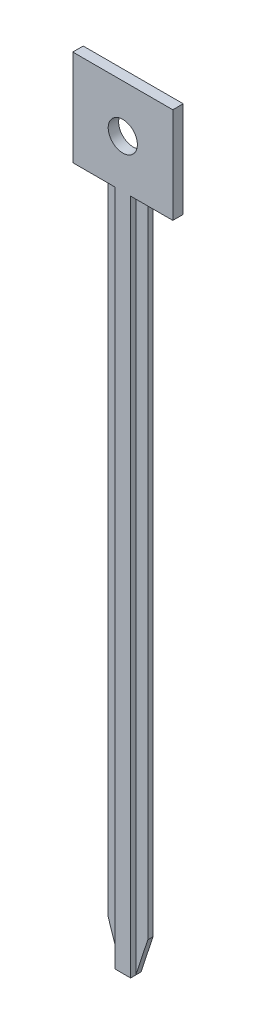
ISO-10303-21;
HEADER;
FILE_DESCRIPTION(('STEP AP214'),'2;1');
FILE_NAME('part.step','',(''),(''),'','','');
FILE_SCHEMA(('AUTOMOTIVE_DESIGN { 1 0 10303 214 1 1 1 1 }'));
ENDSEC;
DATA;
#1=APPLICATION_CONTEXT('core data for automotive mechanical design processes');
#2=APPLICATION_PROTOCOL_DEFINITION('international standard','automotive_design',2000,#1);
#3=PRODUCT_CONTEXT('',#1,'mechanical');
#4=PRODUCT('Part','Part','',(#3));
#5=PRODUCT_RELATED_PRODUCT_CATEGORY('part','',(#4));
#6=PRODUCT_DEFINITION_FORMATION('','',#4);
#7=PRODUCT_DEFINITION_CONTEXT('part definition',#1,'design');
#8=PRODUCT_DEFINITION('design','',#6,#7);
#9=PRODUCT_DEFINITION_SHAPE('','',#8);
#10=(LENGTH_UNIT() NAMED_UNIT(*) SI_UNIT(.MILLI.,.METRE.));
#11=(NAMED_UNIT(*) PLANE_ANGLE_UNIT() SI_UNIT($,.RADIAN.));
#12=(NAMED_UNIT(*) SI_UNIT($,.STERADIAN.) SOLID_ANGLE_UNIT());
#13=UNCERTAINTY_MEASURE_WITH_UNIT(LENGTH_MEASURE(1.E-05),#10,'distance_accuracy_value','');
#14=(GEOMETRIC_REPRESENTATION_CONTEXT(3) GLOBAL_UNCERTAINTY_ASSIGNED_CONTEXT((#13)) GLOBAL_UNIT_ASSIGNED_CONTEXT((#10,
#11,#12)) REPRESENTATION_CONTEXT('',''));
#15=CARTESIAN_POINT('',(0.,0.,0.));
#16=DIRECTION('',(0.,0.,1.));
#17=DIRECTION('',(1.,0.,0.));
#18=AXIS2_PLACEMENT_3D('',#15,#16,#17);
#19=CARTESIAN_POINT('',(0.,-11.684,1.27));
#20=DIRECTION('',(1.,0.,0.));
#21=DIRECTION('',(0.,0.,-1.));
#22=AXIS2_PLACEMENT_3D('',#19,#20,#21);
#23=PLANE('',#22);
#24=DIRECTION('',(0.,-1.,0.));
#25=VECTOR('',#24,1.);
#26=CARTESIAN_POINT('',(0.,-11.684,0.));
#27=LINE('',#26,#25);
#28=CARTESIAN_POINT('',(0.,0.,0.));
#29=VERTEX_POINT('',#28);
#30=CARTESIAN_POINT('',(0.,-11.684,0.));
#31=VERTEX_POINT('',#30);
#32=EDGE_CURVE('E134',#29,#31,#27,.T.);
#33=ORIENTED_EDGE('',*,*,#32,.T.);
#34=DIRECTION('',(0.,0.,-1.));
#35=VECTOR('',#34,1.);
#36=CARTESIAN_POINT('',(0.,-11.684,1.27));
#37=LINE('',#36,#35);
#38=CARTESIAN_POINT('',(0.,-11.684,1.27));
#39=VERTEX_POINT('',#38);
#40=EDGE_CURVE('E11',#39,#31,#37,.T.);
#41=ORIENTED_EDGE('',*,*,#40,.F.);
#42=DIRECTION('',(0.,-1.,0.));
#43=VECTOR('',#42,1.);
#44=CARTESIAN_POINT('',(0.,-11.684,1.27));
#45=LINE('',#44,#43);
#46=CARTESIAN_POINT('',(0.,0.,1.27));
#47=VERTEX_POINT('',#46);
#48=EDGE_CURVE('E160',#47,#39,#45,.T.);
#49=ORIENTED_EDGE('',*,*,#48,.F.);
#50=DIRECTION('',(0.,0.,-1.));
#51=VECTOR('',#50,1.);
#52=CARTESIAN_POINT('',(0.,0.,1.27));
#53=LINE('',#52,#51);
#54=EDGE_CURVE('E130',#47,#29,#53,.T.);
#55=ORIENTED_EDGE('',*,*,#54,.T.);
#56=EDGE_LOOP('',(#33,#41,#49,#55));
#57=FACE_BOUND('',#56,.T.);
#58=ADVANCED_FACE('F32',(#57),#23,.F.);
#59=CARTESIAN_POINT('',(0.,-11.684,1.27));
#60=DIRECTION('',(0.,1.,0.));
#61=DIRECTION('',(-1.,0.,0.));
#62=AXIS2_PLACEMENT_3D('',#59,#60,#61);
#63=PLANE('',#62);
#64=DIRECTION('',(1.,0.,0.));
#65=VECTOR('',#64,1.);
#66=CARTESIAN_POINT('',(0.,-11.684,0.));
#67=LINE('',#66,#65);
#68=CARTESIAN_POINT('',(3.683,-11.684,0.));
#69=VERTEX_POINT('',#68);
#70=EDGE_CURVE('E137',#31,#69,#67,.T.);
#71=ORIENTED_EDGE('',*,*,#70,.T.);
#72=DIRECTION('',(0.,0.,-1.));
#73=VECTOR('',#72,1.);
#74=CARTESIAN_POINT('',(3.683,-11.684,1.27));
#75=LINE('',#74,#73);
#76=CARTESIAN_POINT('',(3.683,-11.684,0.635));
#77=VERTEX_POINT('',#76);
#78=EDGE_CURVE('E39',#77,#69,#75,.T.);
#79=ORIENTED_EDGE('',*,*,#78,.F.);
#80=DIRECTION('',(-1.,0.,0.));
#81=VECTOR('',#80,1.);
#82=CARTESIAN_POINT('',(5.14350000000001,-11.684,0.635));
#83=LINE('',#82,#81);
#84=CARTESIAN_POINT('',(5.14350000000001,-11.684,0.635));
#85=VERTEX_POINT('',#84);
#86=EDGE_CURVE('E253',#85,#77,#83,.T.);
#87=ORIENTED_EDGE('',*,*,#86,.F.);
#88=DIRECTION('',(0.,0.,1.));
#89=VECTOR('',#88,1.);
#90=CARTESIAN_POINT('',(5.14350000000001,-11.684,0.635));
#91=LINE('',#90,#89);
#92=CARTESIAN_POINT('',(5.14350000000001,-11.684,1.27));
#93=VERTEX_POINT('',#92);
#94=EDGE_CURVE('E138',#85,#93,#91,.T.);
#95=ORIENTED_EDGE('',*,*,#94,.T.);
#96=DIRECTION('',(1.,0.,0.));
#97=VECTOR('',#96,1.);
#98=CARTESIAN_POINT('',(0.,-11.684,1.27));
#99=LINE('',#98,#97);
#100=EDGE_CURVE('E102',#39,#93,#99,.T.);
#101=ORIENTED_EDGE('',*,*,#100,.F.);
#102=ORIENTED_EDGE('',*,*,#40,.T.);
#103=EDGE_LOOP('',(#71,#79,#87,#95,#101,#102));
#104=FACE_BOUND('',#103,.T.);
#105=ADVANCED_FACE('F186',(#104),#63,.F.);
#106=CARTESIAN_POINT('',(3.683,-11.684,1.27));
#107=DIRECTION('',(1.,0.,0.));
#108=DIRECTION('',(0.,0.,-1.));
#109=AXIS2_PLACEMENT_3D('',#106,#107,#108);
#110=PLANE('',#109);
#111=DIRECTION('',(0.,0.,-1.));
#112=VECTOR('',#111,1.);
#113=CARTESIAN_POINT('',(3.683,-89.789,1.27));
#114=LINE('',#113,#112);
#115=CARTESIAN_POINT('',(3.683,-89.789,0.635));
#116=VERTEX_POINT('',#115);
#117=CARTESIAN_POINT('',(3.683,-89.789,0.));
#118=VERTEX_POINT('',#117);
#119=EDGE_CURVE('E174',#116,#118,#114,.T.);
#120=ORIENTED_EDGE('',*,*,#119,.F.);
#121=DIRECTION('',(0.,-1.,0.));
#122=VECTOR('',#121,1.);
#123=CARTESIAN_POINT('',(3.683,-11.684,0.635));
#124=LINE('',#123,#122);
#125=EDGE_CURVE('E184',#77,#116,#124,.T.);
#126=ORIENTED_EDGE('',*,*,#125,.F.);
#127=ORIENTED_EDGE('',*,*,#78,.T.);
#128=DIRECTION('',(0.,-1.,0.));
#129=VECTOR('',#128,1.);
#130=CARTESIAN_POINT('',(3.683,-11.684,0.));
#131=LINE('',#130,#129);
#132=EDGE_CURVE('E141',#69,#118,#131,.T.);
#133=ORIENTED_EDGE('',*,*,#132,.T.);
#134=EDGE_LOOP('',(#120,#126,#127,#133));
#135=FACE_BOUND('',#134,.T.);
#136=ADVANCED_FACE('F179',(#135),#110,.F.);
#137=CARTESIAN_POINT('',(5.14350000000001,-94.234,1.27));
#138=DIRECTION('',(0.950031749040489,0.31215328897045,0.));
#139=DIRECTION('',(-0.31215328897045,0.950031749040489,0.));
#140=AXIS2_PLACEMENT_3D('',#137,#138,#139);
#141=PLANE('',#140);
#142=DIRECTION('',(0.,0.,-1.));
#143=VECTOR('',#142,1.);
#144=CARTESIAN_POINT('',(5.14350000000001,-94.234,1.27));
#145=LINE('',#144,#143);
#146=CARTESIAN_POINT('',(5.14350000000001,-94.234,0.635));
#147=VERTEX_POINT('',#146);
#148=CARTESIAN_POINT('',(5.14350000000001,-94.234,0.));
#149=VERTEX_POINT('',#148);
#150=EDGE_CURVE('E170',#147,#149,#145,.T.);
#151=ORIENTED_EDGE('',*,*,#150,.F.);
#152=DIRECTION('',(0.31215328897045,-0.950031749040489,0.));
#153=VECTOR('',#152,1.);
#154=CARTESIAN_POINT('',(3.683,-89.789,0.635));
#155=LINE('',#154,#153);
#156=EDGE_CURVE('E199',#116,#147,#155,.T.);
#157=ORIENTED_EDGE('',*,*,#156,.F.);
#158=ORIENTED_EDGE('',*,*,#119,.T.);
#159=DIRECTION('',(0.31215328897045,-0.950031749040489,0.));
#160=VECTOR('',#159,1.);
#161=CARTESIAN_POINT('',(5.14350000000001,-94.234,0.));
#162=LINE('',#161,#160);
#163=EDGE_CURVE('E144',#118,#149,#162,.T.);
#164=ORIENTED_EDGE('',*,*,#163,.T.);
#165=EDGE_LOOP('',(#151,#157,#158,#164));
#166=FACE_BOUND('',#165,.T.);
#167=ADVANCED_FACE('F195',(#166),#141,.F.);
#168=CARTESIAN_POINT('',(7.04850000000001,-94.234,1.27));
#169=DIRECTION('',(0.,1.,0.));
#170=DIRECTION('',(0.,0.,1.));
#171=AXIS2_PLACEMENT_3D('',#168,#169,#170);
#172=PLANE('',#171);
#173=DIRECTION('',(1.,0.,0.));
#174=VECTOR('',#173,1.);
#175=CARTESIAN_POINT('',(7.04850000000001,-94.234,0.));
#176=LINE('',#175,#174);
#177=CARTESIAN_POINT('',(7.04850000000001,-94.234,0.));
#178=VERTEX_POINT('',#177);
#179=EDGE_CURVE('E147',#149,#178,#176,.T.);
#180=ORIENTED_EDGE('',*,*,#179,.T.);
#181=DIRECTION('',(0.,0.,-1.));
#182=VECTOR('',#181,1.);
#183=CARTESIAN_POINT('',(7.04850000000001,-94.234,1.27));
#184=LINE('',#183,#182);
#185=CARTESIAN_POINT('',(7.04850000000001,-94.234,0.635));
#186=VERTEX_POINT('',#185);
#187=EDGE_CURVE('E166',#186,#178,#184,.T.);
#188=ORIENTED_EDGE('',*,*,#187,.F.);
#189=CARTESIAN_POINT('',(7.04850000000001,-94.234,1.27));
#190=VERTEX_POINT('',#189);
#191=EDGE_CURVE('E167',#190,#186,#184,.T.);
#192=ORIENTED_EDGE('',*,*,#191,.F.);
#193=DIRECTION('',(1.,0.,0.));
#194=VECTOR('',#193,1.);
#195=CARTESIAN_POINT('',(7.04850000000001,-94.234,1.27));
#196=LINE('',#195,#194);
#197=CARTESIAN_POINT('',(5.14350000000001,-94.234,1.27));
#198=VERTEX_POINT('',#197);
#199=EDGE_CURVE('E116',#198,#190,#196,.T.);
#200=ORIENTED_EDGE('',*,*,#199,.F.);
#201=EDGE_CURVE('E171',#198,#147,#145,.T.);
#202=ORIENTED_EDGE('',*,*,#201,.T.);
#203=ORIENTED_EDGE('',*,*,#150,.T.);
#204=EDGE_LOOP('',(#180,#188,#192,#200,#202,#203));
#205=FACE_BOUND('',#204,.T.);
#206=ADVANCED_FACE('F264',(#205),#172,.F.);
#207=CARTESIAN_POINT('',(7.04850000000001,-94.234,1.27));
#208=DIRECTION('',(-0.95003174904049,0.312153288970447,0.));
#209=DIRECTION('',(-0.312153288970447,-0.95003174904049,0.));
#210=AXIS2_PLACEMENT_3D('',#207,#208,#209);
#211=PLANE('',#210);
#212=DIRECTION('',(0.,0.,-1.));
#213=VECTOR('',#212,1.);
#214=CARTESIAN_POINT('',(8.50900000000001,-89.789,1.27));
#215=LINE('',#214,#213);
#216=CARTESIAN_POINT('',(8.50900000000001,-89.789,0.635));
#217=VERTEX_POINT('',#216);
#218=CARTESIAN_POINT('',(8.50900000000001,-89.789,0.));
#219=VERTEX_POINT('',#218);
#220=EDGE_CURVE('E164',#217,#219,#215,.T.);
#221=ORIENTED_EDGE('',*,*,#220,.F.);
#222=DIRECTION('',(0.312153288970447,0.95003174904049,0.));
#223=VECTOR('',#222,1.);
#224=CARTESIAN_POINT('',(8.50900000000001,-89.789,0.635));
#225=LINE('',#224,#223);
#226=EDGE_CURVE('E235',#186,#217,#225,.T.);
#227=ORIENTED_EDGE('',*,*,#226,.F.);
#228=ORIENTED_EDGE('',*,*,#187,.T.);
#229=DIRECTION('',(0.312153288970447,0.95003174904049,0.));
#230=VECTOR('',#229,1.);
#231=CARTESIAN_POINT('',(7.04850000000001,-94.234,0.));
#232=LINE('',#231,#230);
#233=EDGE_CURVE('E150',#178,#219,#232,.T.);
#234=ORIENTED_EDGE('',*,*,#233,.T.);
#235=EDGE_LOOP('',(#221,#227,#228,#234));
#236=FACE_BOUND('',#235,.T.);
#237=ADVANCED_FACE('F267',(#236),#211,.F.);
#238=CARTESIAN_POINT('',(8.509,-11.684,1.27));
#239=DIRECTION('',(-1.,0.,0.));
#240=DIRECTION('',(0.,-1.,0.));
#241=AXIS2_PLACEMENT_3D('',#238,#239,#240);
#242=PLANE('',#241);
#243=DIRECTION('',(0.,0.,-1.));
#244=VECTOR('',#243,1.);
#245=CARTESIAN_POINT('',(8.509,-11.684,1.27));
#246=LINE('',#245,#244);
#247=CARTESIAN_POINT('',(8.509,-11.684,0.635));
#248=VERTEX_POINT('',#247);
#249=CARTESIAN_POINT('',(8.509,-11.684,0.));
#250=VERTEX_POINT('',#249);
#251=EDGE_CURVE('E125',#248,#250,#246,.T.);
#252=ORIENTED_EDGE('',*,*,#251,.F.);
#253=DIRECTION('',(0.,1.,0.));
#254=VECTOR('',#253,1.);
#255=CARTESIAN_POINT('',(8.509,-11.684,0.635));
#256=LINE('',#255,#254);
#257=EDGE_CURVE('E227',#217,#248,#256,.T.);
#258=ORIENTED_EDGE('',*,*,#257,.F.);
#259=ORIENTED_EDGE('',*,*,#220,.T.);
#260=DIRECTION('',(0.,1.,0.));
#261=VECTOR('',#260,1.);
#262=CARTESIAN_POINT('',(8.509,-11.684,0.));
#263=LINE('',#262,#261);
#264=EDGE_CURVE('E153',#219,#250,#263,.T.);
#265=ORIENTED_EDGE('',*,*,#264,.T.);
#266=EDGE_LOOP('',(#252,#258,#259,#265));
#267=FACE_BOUND('',#266,.T.);
#268=ADVANCED_FACE('F270',(#267),#242,.F.);
#269=CARTESIAN_POINT('',(12.192,-11.684,1.27));
#270=DIRECTION('',(0.,1.,0.));
#271=DIRECTION('',(0.,0.,1.));
#272=AXIS2_PLACEMENT_3D('',#269,#270,#271);
#273=PLANE('',#272);
#274=DIRECTION('',(1.,0.,0.));
#275=VECTOR('',#274,1.);
#276=CARTESIAN_POINT('',(12.192,-11.684,0.));
#277=LINE('',#276,#275);
#278=CARTESIAN_POINT('',(12.192,-11.684,0.));
#279=VERTEX_POINT('',#278);
#280=EDGE_CURVE('E122',#250,#279,#277,.T.);
#281=ORIENTED_EDGE('',*,*,#280,.T.);
#282=DIRECTION('',(0.,0.,-1.));
#283=VECTOR('',#282,1.);
#284=CARTESIAN_POINT('',(12.192,-11.684,1.27));
#285=LINE('',#284,#283);
#286=CARTESIAN_POINT('',(12.192,-11.684,1.27));
#287=VERTEX_POINT('',#286);
#288=EDGE_CURVE('E119',#287,#279,#285,.T.);
#289=ORIENTED_EDGE('',*,*,#288,.F.);
#290=DIRECTION('',(1.,0.,0.));
#291=VECTOR('',#290,1.);
#292=CARTESIAN_POINT('',(12.192,-11.684,1.27));
#293=LINE('',#292,#291);
#294=CARTESIAN_POINT('',(7.04850000000001,-11.684,1.27));
#295=VERTEX_POINT('',#294);
#296=EDGE_CURVE('E46',#295,#287,#293,.T.);
#297=ORIENTED_EDGE('',*,*,#296,.F.);
#298=DIRECTION('',(0.,0.,1.));
#299=VECTOR('',#298,1.);
#300=CARTESIAN_POINT('',(7.04850000000001,-11.684,0.635));
#301=LINE('',#300,#299);
#302=CARTESIAN_POINT('',(7.04850000000001,-11.684,0.635));
#303=VERTEX_POINT('',#302);
#304=EDGE_CURVE('E220',#303,#295,#301,.T.);
#305=ORIENTED_EDGE('',*,*,#304,.F.);
#306=DIRECTION('',(-1.,0.,0.));
#307=VECTOR('',#306,1.);
#308=CARTESIAN_POINT('',(7.04850000000001,-11.684,0.635));
#309=LINE('',#308,#307);
#310=EDGE_CURVE('E223',#248,#303,#309,.T.);
#311=ORIENTED_EDGE('',*,*,#310,.F.);
#312=ORIENTED_EDGE('',*,*,#251,.T.);
#313=EDGE_LOOP('',(#281,#289,#297,#305,#311,#312));
#314=FACE_BOUND('',#313,.T.);
#315=ADVANCED_FACE('F120',(#314),#273,.F.);
#316=CARTESIAN_POINT('',(12.192,0.,1.27));
#317=DIRECTION('',(-1.,0.,0.));
#318=DIRECTION('',(0.,-1.,0.));
#319=AXIS2_PLACEMENT_3D('',#316,#317,#318);
#320=PLANE('',#319);
#321=DIRECTION('',(0.,1.,0.));
#322=VECTOR('',#321,1.);
#323=CARTESIAN_POINT('',(12.192,0.,0.));
#324=LINE('',#323,#322);
#325=CARTESIAN_POINT('',(12.192,0.,0.));
#326=VERTEX_POINT('',#325);
#327=EDGE_CURVE('E157',#279,#326,#324,.T.);
#328=ORIENTED_EDGE('',*,*,#327,.T.);
#329=DIRECTION('',(0.,0.,-1.));
#330=VECTOR('',#329,1.);
#331=CARTESIAN_POINT('',(12.192,0.,1.27));
#332=LINE('',#331,#330);
#333=CARTESIAN_POINT('',(12.192,0.,1.27));
#334=VERTEX_POINT('',#333);
#335=EDGE_CURVE('E126',#334,#326,#332,.T.);
#336=ORIENTED_EDGE('',*,*,#335,.F.);
#337=DIRECTION('',(0.,1.,0.));
#338=VECTOR('',#337,1.);
#339=CARTESIAN_POINT('',(12.192,0.,1.27));
#340=LINE('',#339,#338);
#341=EDGE_CURVE('E111',#287,#334,#340,.T.);
#342=ORIENTED_EDGE('',*,*,#341,.F.);
#343=ORIENTED_EDGE('',*,*,#288,.T.);
#344=EDGE_LOOP('',(#328,#336,#342,#343));
#345=FACE_BOUND('',#344,.T.);
#346=ADVANCED_FACE('F128',(#345),#320,.F.);
#347=CARTESIAN_POINT('',(0.,0.,1.27));
#348=DIRECTION('',(0.,-1.,0.));
#349=DIRECTION('',(0.,0.,-1.));
#350=AXIS2_PLACEMENT_3D('',#347,#348,#349);
#351=PLANE('',#350);
#352=DIRECTION('',(-1.,0.,0.));
#353=VECTOR('',#352,1.);
#354=CARTESIAN_POINT('',(0.,0.,0.));
#355=LINE('',#354,#353);
#356=EDGE_CURVE('E94',#326,#29,#355,.T.);
#357=ORIENTED_EDGE('',*,*,#356,.T.);
#358=ORIENTED_EDGE('',*,*,#54,.F.);
#359=DIRECTION('',(-1.,0.,0.));
#360=VECTOR('',#359,1.);
#361=CARTESIAN_POINT('',(0.,0.,1.27));
#362=LINE('',#361,#360);
#363=EDGE_CURVE('E55',#334,#47,#362,.T.);
#364=ORIENTED_EDGE('',*,*,#363,.F.);
#365=ORIENTED_EDGE('',*,*,#335,.T.);
#366=EDGE_LOOP('',(#357,#358,#364,#365));
#367=FACE_BOUND('',#366,.T.);
#368=ADVANCED_FACE('F271',(#367),#351,.F.);
#369=CARTESIAN_POINT('',(0.,0.,1.27));
#370=DIRECTION('',(0.,0.,-1.));
#371=DIRECTION('',(-1.,0.,0.));
#372=AXIS2_PLACEMENT_3D('',#369,#370,#371);
#373=PLANE('',#372);
#374=CARTESIAN_POINT('',(6.096,-5.842,1.27));
#375=DIRECTION('',(0.,0.,1.));
#376=DIRECTION('',(1.,0.,0.));
#377=AXIS2_PLACEMENT_3D('',#374,#375,#376);
#378=CIRCLE('',#377,1.778);
#379=CARTESIAN_POINT('',(7.874,-5.842,1.27));
#380=VERTEX_POINT('',#379);
#381=EDGE_CURVE('E244',#380,#380,#378,.T.);
#382=ORIENTED_EDGE('',*,*,#381,.F.);
#383=EDGE_LOOP('',(#382));
#384=FACE_BOUND('',#383,.T.);
#385=DIRECTION('',(0.,-1.,0.));
#386=VECTOR('',#385,1.);
#387=CARTESIAN_POINT('',(7.04850000000001,-94.234,1.27));
#388=LINE('',#387,#386);
#389=EDGE_CURVE('E115',#295,#190,#388,.T.);
#390=ORIENTED_EDGE('',*,*,#389,.F.);
#391=ORIENTED_EDGE('',*,*,#296,.T.);
#392=ORIENTED_EDGE('',*,*,#341,.T.);
#393=ORIENTED_EDGE('',*,*,#363,.T.);
#394=ORIENTED_EDGE('',*,*,#48,.T.);
#395=ORIENTED_EDGE('',*,*,#100,.T.);
#396=DIRECTION('',(0.,1.,0.));
#397=VECTOR('',#396,1.);
#398=CARTESIAN_POINT('',(5.14350000000001,-94.234,1.27));
#399=LINE('',#398,#397);
#400=EDGE_CURVE('E226',#198,#93,#399,.T.);
#401=ORIENTED_EDGE('',*,*,#400,.F.);
#402=ORIENTED_EDGE('',*,*,#199,.T.);
#403=EDGE_LOOP('',(#390,#391,#392,#393,#394,#395,#401,#402));
#404=FACE_BOUND('',#403,.T.);
#405=ADVANCED_FACE('F109',(#384,#404),#373,.F.);
#406=CARTESIAN_POINT('',(0.,0.,0.));
#407=DIRECTION('',(0.,0.,-1.));
#408=DIRECTION('',(-1.,0.,0.));
#409=AXIS2_PLACEMENT_3D('',#406,#407,#408);
#410=PLANE('',#409);
#411=CARTESIAN_POINT('',(6.096,-5.842,0.));
#412=DIRECTION('',(0.,0.,1.));
#413=DIRECTION('',(1.,0.,0.));
#414=AXIS2_PLACEMENT_3D('',#411,#412,#413);
#415=CIRCLE('',#414,1.778);
#416=CARTESIAN_POINT('',(7.874,-5.842,0.));
#417=VERTEX_POINT('',#416);
#418=EDGE_CURVE('E241',#417,#417,#415,.T.);
#419=ORIENTED_EDGE('',*,*,#418,.T.);
#420=EDGE_LOOP('',(#419));
#421=FACE_BOUND('',#420,.T.);
#422=ORIENTED_EDGE('',*,*,#32,.F.);
#423=ORIENTED_EDGE('',*,*,#356,.F.);
#424=ORIENTED_EDGE('',*,*,#327,.F.);
#425=ORIENTED_EDGE('',*,*,#280,.F.);
#426=ORIENTED_EDGE('',*,*,#264,.F.);
#427=ORIENTED_EDGE('',*,*,#233,.F.);
#428=ORIENTED_EDGE('',*,*,#179,.F.);
#429=ORIENTED_EDGE('',*,*,#163,.F.);
#430=ORIENTED_EDGE('',*,*,#132,.F.);
#431=ORIENTED_EDGE('',*,*,#70,.F.);
#432=EDGE_LOOP('',(#422,#423,#424,#425,#426,#427,#428,#429,#430,#431));
#433=FACE_BOUND('',#432,.T.);
#434=ADVANCED_FACE('F190',(#421,#433),#410,.T.);
#435=CARTESIAN_POINT('',(5.14350000000001,-94.234,0.635));
#436=DIRECTION('',(1.,0.,0.));
#437=DIRECTION('',(0.,0.,-1.));
#438=AXIS2_PLACEMENT_3D('',#435,#436,#437);
#439=PLANE('',#438);
#440=ORIENTED_EDGE('',*,*,#400,.T.);
#441=ORIENTED_EDGE('',*,*,#94,.F.);
#442=DIRECTION('',(0.,1.,0.));
#443=VECTOR('',#442,1.);
#444=CARTESIAN_POINT('',(5.14350000000001,-94.234,0.635));
#445=LINE('',#444,#443);
#446=EDGE_CURVE('E250',#147,#85,#445,.T.);
#447=ORIENTED_EDGE('',*,*,#446,.F.);
#448=ORIENTED_EDGE('',*,*,#201,.F.);
#449=EDGE_LOOP('',(#440,#441,#447,#448));
#450=FACE_BOUND('',#449,.T.);
#451=ADVANCED_FACE('F275',(#450),#439,.F.);
#452=CARTESIAN_POINT('',(-21.9800714285717,-11.684,0.635));
#453=DIRECTION('',(0.,0.,-1.));
#454=DIRECTION('',(-1.,0.,0.));
#455=AXIS2_PLACEMENT_3D('',#452,#453,#454);
#456=PLANE('',#455);
#457=ORIENTED_EDGE('',*,*,#156,.T.);
#458=ORIENTED_EDGE('',*,*,#446,.T.);
#459=ORIENTED_EDGE('',*,*,#86,.T.);
#460=ORIENTED_EDGE('',*,*,#125,.T.);
#461=EDGE_LOOP('',(#457,#458,#459,#460));
#462=FACE_BOUND('',#461,.T.);
#463=ADVANCED_FACE('F276',(#462),#456,.F.);
#464=CARTESIAN_POINT('',(7.04850000000001,-94.234,0.635));
#465=DIRECTION('',(-1.,0.,0.));
#466=DIRECTION('',(0.,0.,1.));
#467=AXIS2_PLACEMENT_3D('',#464,#465,#466);
#468=PLANE('',#467);
#469=ORIENTED_EDGE('',*,*,#389,.T.);
#470=ORIENTED_EDGE('',*,*,#191,.T.);
#471=DIRECTION('',(0.,-1.,0.));
#472=VECTOR('',#471,1.);
#473=CARTESIAN_POINT('',(7.04850000000001,-94.234,0.635));
#474=LINE('',#473,#472);
#475=EDGE_CURVE('E230',#303,#186,#474,.T.);
#476=ORIENTED_EDGE('',*,*,#475,.F.);
#477=ORIENTED_EDGE('',*,*,#304,.T.);
#478=EDGE_LOOP('',(#469,#470,#476,#477));
#479=FACE_BOUND('',#478,.T.);
#480=ADVANCED_FACE('F231',(#479),#468,.F.);
#481=CARTESIAN_POINT('',(8.509,-11.684,0.635));
#482=DIRECTION('',(0.,0.,-1.));
#483=DIRECTION('',(-1.,0.,0.));
#484=AXIS2_PLACEMENT_3D('',#481,#482,#483);
#485=PLANE('',#484);
#486=ORIENTED_EDGE('',*,*,#310,.T.);
#487=ORIENTED_EDGE('',*,*,#475,.T.);
#488=ORIENTED_EDGE('',*,*,#226,.T.);
#489=ORIENTED_EDGE('',*,*,#257,.T.);
#490=EDGE_LOOP('',(#486,#487,#488,#489));
#491=FACE_BOUND('',#490,.T.);
#492=ADVANCED_FACE('F237',(#491),#485,.F.);
#493=CARTESIAN_POINT('',(6.096,-5.842,0.));
#494=DIRECTION('',(0.,0.,1.));
#495=DIRECTION('',(1.,0.,0.));
#496=AXIS2_PLACEMENT_3D('',#493,#494,#495);
#497=CYLINDRICAL_SURFACE('',#496,1.778);
#498=ORIENTED_EDGE('',*,*,#418,.F.);
#499=EDGE_LOOP('',(#498));
#500=FACE_BOUND('',#499,.T.);
#501=ORIENTED_EDGE('',*,*,#381,.T.);
#502=EDGE_LOOP('',(#501));
#503=FACE_BOUND('',#502,.T.);
#504=ADVANCED_FACE('F321',(#500,#503),#497,.F.);
#505=CLOSED_SHELL('',(#58,#105,#136,#167,#206,#237,#268,#315,#346,#368,#405,#434,#451,#463,#480,
#492,#504));
#506=MANIFOLD_SOLID_BREP('B2',#505);
#507=ADVANCED_BREP_SHAPE_REPRESENTATION('',(#18,#506),#14);
#508=SHAPE_DEFINITION_REPRESENTATION(#9,#507);
ENDSEC;
END-ISO-10303-21;
